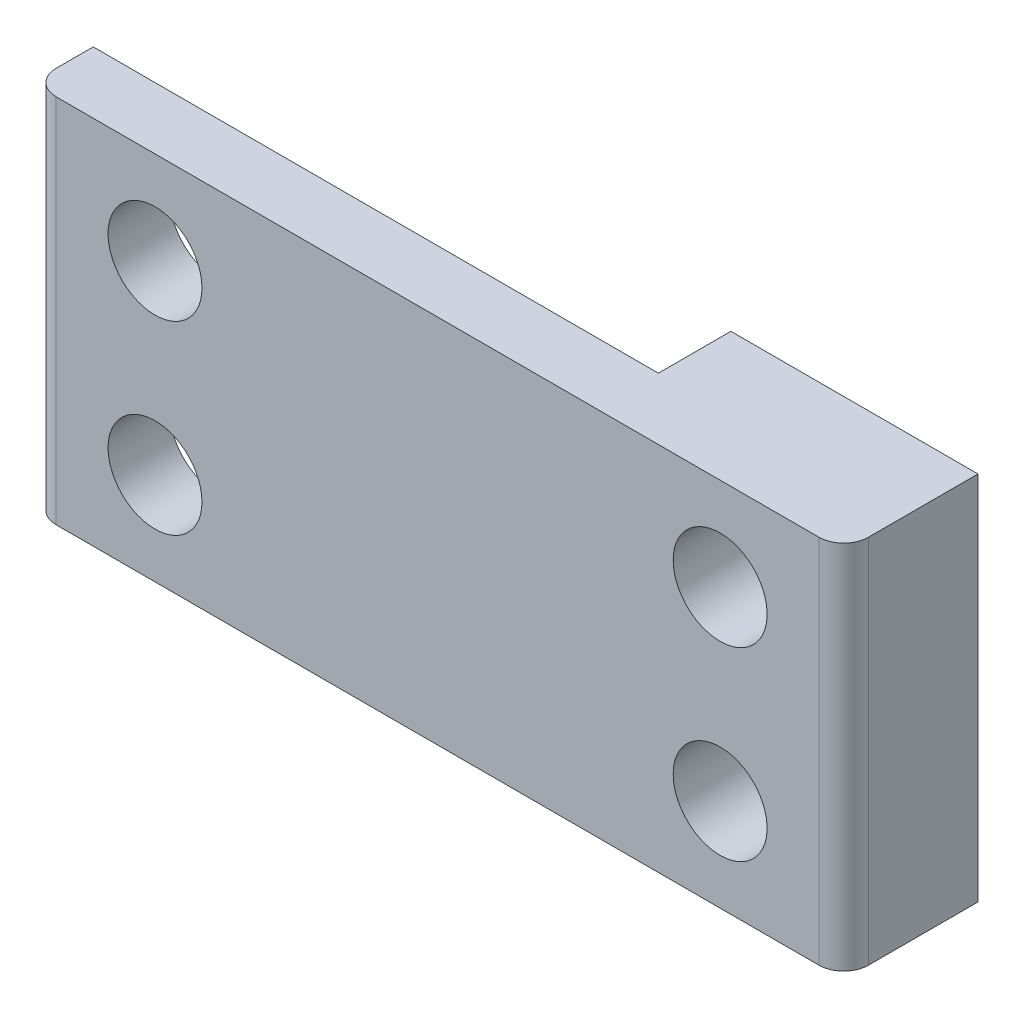
ISO-10303-21;
HEADER;
FILE_DESCRIPTION(('STEP AP214'),'2;1');
FILE_NAME('part.step','',(''),(''),'','','');
FILE_SCHEMA(('AUTOMOTIVE_DESIGN { 1 0 10303 214 1 1 1 1 }'));
ENDSEC;
DATA;
#1=APPLICATION_CONTEXT('core data for automotive mechanical design processes');
#2=APPLICATION_PROTOCOL_DEFINITION('international standard','automotive_design',2000,#1);
#3=PRODUCT_CONTEXT('',#1,'mechanical');
#4=PRODUCT('Part','Part','',(#3));
#5=PRODUCT_RELATED_PRODUCT_CATEGORY('part','',(#4));
#6=PRODUCT_DEFINITION_FORMATION('','',#4);
#7=PRODUCT_DEFINITION_CONTEXT('part definition',#1,'design');
#8=PRODUCT_DEFINITION('design','',#6,#7);
#9=PRODUCT_DEFINITION_SHAPE('','',#8);
#10=(LENGTH_UNIT() NAMED_UNIT(*) SI_UNIT(.MILLI.,.METRE.));
#11=(NAMED_UNIT(*) PLANE_ANGLE_UNIT() SI_UNIT($,.RADIAN.));
#12=(NAMED_UNIT(*) SI_UNIT($,.STERADIAN.) SOLID_ANGLE_UNIT());
#13=UNCERTAINTY_MEASURE_WITH_UNIT(LENGTH_MEASURE(1.E-05),#10,'distance_accuracy_value','');
#14=(GEOMETRIC_REPRESENTATION_CONTEXT(3) GLOBAL_UNCERTAINTY_ASSIGNED_CONTEXT((#13)) GLOBAL_UNIT_ASSIGNED_CONTEXT((#10,
#11,#12)) REPRESENTATION_CONTEXT('',''));
#15=CARTESIAN_POINT('',(0.,0.,0.));
#16=DIRECTION('',(0.,0.,1.));
#17=DIRECTION('',(1.,0.,0.));
#18=AXIS2_PLACEMENT_3D('',#15,#16,#17);
#19=CARTESIAN_POINT('',(41.7449,-19.05,6.35));
#20=DIRECTION('',(-1.,0.,0.));
#21=DIRECTION('',(0.,0.,1.));
#22=AXIS2_PLACEMENT_3D('',#19,#20,#21);
#23=PLANE('',#22);
#24=DIRECTION('',(0.,0.,-1.));
#25=VECTOR('',#24,1.);
#26=CARTESIAN_POINT('',(41.7449,19.05,6.35));
#27=LINE('',#26,#25);
#28=CARTESIAN_POINT('',(41.7449,19.05,3.81));
#29=VERTEX_POINT('',#28);
#30=CARTESIAN_POINT('',(41.7449,19.05,-7.4549));
#31=VERTEX_POINT('',#30);
#32=EDGE_CURVE('E161',#29,#31,#27,.T.);
#33=ORIENTED_EDGE('',*,*,#32,.F.);
#34=DIRECTION('',(0.,1.,0.));
#35=VECTOR('',#34,1.);
#36=CARTESIAN_POINT('',(41.7449,-19.05,3.81));
#37=LINE('',#36,#35);
#38=CARTESIAN_POINT('',(41.7449,-19.05,3.81));
#39=VERTEX_POINT('',#38);
#40=EDGE_CURVE('E11',#29,#39,#37,.F.);
#41=ORIENTED_EDGE('',*,*,#40,.T.);
#42=DIRECTION('',(0.,0.,-1.));
#43=VECTOR('',#42,1.);
#44=CARTESIAN_POINT('',(41.7449,-19.05,6.35));
#45=LINE('',#44,#43);
#46=CARTESIAN_POINT('',(41.7449,-19.05,-7.4549));
#47=VERTEX_POINT('',#46);
#48=EDGE_CURVE('E105',#39,#47,#45,.T.);
#49=ORIENTED_EDGE('',*,*,#48,.T.);
#50=DIRECTION('',(0.,-1.,0.));
#51=VECTOR('',#50,1.);
#52=CARTESIAN_POINT('',(41.7449,19.05,-7.4549));
#53=LINE('',#52,#51);
#54=EDGE_CURVE('E108',#31,#47,#53,.T.);
#55=ORIENTED_EDGE('',*,*,#54,.F.);
#56=EDGE_LOOP('',(#33,#41,#49,#55));
#57=FACE_BOUND('',#56,.T.);
#58=ADVANCED_FACE('F40',(#57),#23,.F.);
#59=CARTESIAN_POINT('',(-41.7449,19.05,6.35));
#60=DIRECTION('',(0.,-1.,0.));
#61=DIRECTION('',(0.,0.,-1.));
#62=AXIS2_PLACEMENT_3D('',#59,#60,#61);
#63=PLANE('',#62);
#64=DIRECTION('',(0.,0.,-1.));
#65=VECTOR('',#64,1.);
#66=CARTESIAN_POINT('',(-41.7449,19.05,6.35));
#67=LINE('',#66,#65);
#68=CARTESIAN_POINT('',(-41.7449,19.05,3.81));
#69=VERTEX_POINT('',#68);
#70=CARTESIAN_POINT('',(-41.7449,19.05,0.));
#71=VERTEX_POINT('',#70);
#72=EDGE_CURVE('E159',#69,#71,#67,.T.);
#73=ORIENTED_EDGE('',*,*,#72,.F.);
#74=CARTESIAN_POINT('',(-39.2049,19.05,3.81));
#75=DIRECTION('',(0.,-1.,0.));
#76=DIRECTION('',(0.,0.,-1.));
#77=AXIS2_PLACEMENT_3D('',#74,#75,#76);
#78=CIRCLE('',#77,2.54);
#79=CARTESIAN_POINT('',(-39.2049,19.05,6.35));
#80=VERTEX_POINT('',#79);
#81=EDGE_CURVE('E48',#69,#80,#78,.F.);
#82=ORIENTED_EDGE('',*,*,#81,.T.);
#83=DIRECTION('',(-1.,0.,0.));
#84=VECTOR('',#83,1.);
#85=CARTESIAN_POINT('',(-41.7449,19.05,6.35));
#86=LINE('',#85,#84);
#87=CARTESIAN_POINT('',(39.2049,19.05,6.35));
#88=VERTEX_POINT('',#87);
#89=EDGE_CURVE('E146',#88,#80,#86,.T.);
#90=ORIENTED_EDGE('',*,*,#89,.F.);
#91=CARTESIAN_POINT('',(39.2049,19.05,3.81));
#92=DIRECTION('',(0.,-1.,0.));
#93=DIRECTION('',(0.,0.,-1.));
#94=AXIS2_PLACEMENT_3D('',#91,#92,#93);
#95=CIRCLE('',#94,2.54);
#96=EDGE_CURVE('E55',#88,#29,#95,.F.);
#97=ORIENTED_EDGE('',*,*,#96,.T.);
#98=ORIENTED_EDGE('',*,*,#32,.T.);
#99=DIRECTION('',(1.,0.,0.));
#100=VECTOR('',#99,1.);
#101=CARTESIAN_POINT('',(41.7449,19.05,-7.4549));
#102=LINE('',#101,#100);
#103=CARTESIAN_POINT('',(16.3449,19.05,-7.4549));
#104=VERTEX_POINT('',#103);
#105=EDGE_CURVE('E129',#104,#31,#102,.T.);
#106=ORIENTED_EDGE('',*,*,#105,.F.);
#107=DIRECTION('',(0.,0.,1.));
#108=VECTOR('',#107,1.);
#109=CARTESIAN_POINT('',(16.3449,19.05,-7.4549));
#110=LINE('',#109,#108);
#111=CARTESIAN_POINT('',(16.3449,19.05,0.));
#112=VERTEX_POINT('',#111);
#113=EDGE_CURVE('E140',#104,#112,#110,.T.);
#114=ORIENTED_EDGE('',*,*,#113,.T.);
#115=DIRECTION('',(-1.,0.,0.));
#116=VECTOR('',#115,1.);
#117=CARTESIAN_POINT('',(-41.7449,19.05,0.));
#118=LINE('',#117,#116);
#119=EDGE_CURVE('E145',#112,#71,#118,.T.);
#120=ORIENTED_EDGE('',*,*,#119,.T.);
#121=EDGE_LOOP('',(#73,#82,#90,#97,#98,#106,#114,#120));
#122=FACE_BOUND('',#121,.T.);
#123=ADVANCED_FACE('F188',(#122),#63,.F.);
#124=CARTESIAN_POINT('',(-41.7449,-19.05,6.35));
#125=DIRECTION('',(1.,0.,0.));
#126=DIRECTION('',(0.,0.,-1.));
#127=AXIS2_PLACEMENT_3D('',#124,#125,#126);
#128=PLANE('',#127);
#129=DIRECTION('',(0.,0.,-1.));
#130=VECTOR('',#129,1.);
#131=CARTESIAN_POINT('',(-41.7449,-19.05,6.35));
#132=LINE('',#131,#130);
#133=CARTESIAN_POINT('',(-41.7449,-19.05,3.81));
#134=VERTEX_POINT('',#133);
#135=CARTESIAN_POINT('',(-41.7449,-19.05,0.));
#136=VERTEX_POINT('',#135);
#137=EDGE_CURVE('E112',#134,#136,#132,.T.);
#138=ORIENTED_EDGE('',*,*,#137,.F.);
#139=DIRECTION('',(0.,-1.,0.));
#140=VECTOR('',#139,1.);
#141=CARTESIAN_POINT('',(-41.7449,-19.05,3.81));
#142=LINE('',#141,#140);
#143=EDGE_CURVE('E63',#134,#69,#142,.F.);
#144=ORIENTED_EDGE('',*,*,#143,.T.);
#145=ORIENTED_EDGE('',*,*,#72,.T.);
#146=DIRECTION('',(0.,-1.,0.));
#147=VECTOR('',#146,1.);
#148=CARTESIAN_POINT('',(-41.7449,-19.05,0.));
#149=LINE('',#148,#147);
#150=EDGE_CURVE('E154',#71,#136,#149,.T.);
#151=ORIENTED_EDGE('',*,*,#150,.T.);
#152=EDGE_LOOP('',(#138,#144,#145,#151));
#153=FACE_BOUND('',#152,.T.);
#154=ADVANCED_FACE('F195',(#153),#128,.F.);
#155=CARTESIAN_POINT('',(-41.7449,-19.05,6.35));
#156=DIRECTION('',(0.,1.,0.));
#157=DIRECTION('',(0.,0.,1.));
#158=AXIS2_PLACEMENT_3D('',#155,#156,#157);
#159=PLANE('',#158);
#160=DIRECTION('',(1.,0.,0.));
#161=VECTOR('',#160,1.);
#162=CARTESIAN_POINT('',(-41.7449,-19.05,6.35));
#163=LINE('',#162,#161);
#164=CARTESIAN_POINT('',(-39.2049,-19.05,6.35));
#165=VERTEX_POINT('',#164);
#166=CARTESIAN_POINT('',(39.2049,-19.05,6.35));
#167=VERTEX_POINT('',#166);
#168=EDGE_CURVE('E113',#165,#167,#163,.T.);
#169=ORIENTED_EDGE('',*,*,#168,.F.);
#170=CARTESIAN_POINT('',(-39.2049,-19.05,3.81));
#171=DIRECTION('',(0.,1.,0.));
#172=DIRECTION('',(0.,0.,1.));
#173=AXIS2_PLACEMENT_3D('',#170,#171,#172);
#174=CIRCLE('',#173,2.54);
#175=EDGE_CURVE('E184',#165,#134,#174,.F.);
#176=ORIENTED_EDGE('',*,*,#175,.T.);
#177=ORIENTED_EDGE('',*,*,#137,.T.);
#178=DIRECTION('',(1.,0.,0.));
#179=VECTOR('',#178,1.);
#180=CARTESIAN_POINT('',(-41.7449,-19.05,0.));
#181=LINE('',#180,#179);
#182=CARTESIAN_POINT('',(16.3449,-19.05,0.));
#183=VERTEX_POINT('',#182);
#184=EDGE_CURVE('E149',#136,#183,#181,.T.);
#185=ORIENTED_EDGE('',*,*,#184,.T.);
#186=DIRECTION('',(0.,0.,1.));
#187=VECTOR('',#186,1.);
#188=CARTESIAN_POINT('',(16.3449,-19.05,-7.4549));
#189=LINE('',#188,#187);
#190=CARTESIAN_POINT('',(16.3449,-19.05,-7.4549));
#191=VERTEX_POINT('',#190);
#192=EDGE_CURVE('E121',#191,#183,#189,.T.);
#193=ORIENTED_EDGE('',*,*,#192,.F.);
#194=DIRECTION('',(-1.,0.,0.));
#195=VECTOR('',#194,1.);
#196=CARTESIAN_POINT('',(41.7449,-19.05,-7.4549));
#197=LINE('',#196,#195);
#198=EDGE_CURVE('E116',#47,#191,#197,.T.);
#199=ORIENTED_EDGE('',*,*,#198,.F.);
#200=ORIENTED_EDGE('',*,*,#48,.F.);
#201=CARTESIAN_POINT('',(39.2049,-19.05,3.81));
#202=DIRECTION('',(0.,1.,0.));
#203=DIRECTION('',(0.,0.,1.));
#204=AXIS2_PLACEMENT_3D('',#201,#202,#203);
#205=CIRCLE('',#204,2.54);
#206=EDGE_CURVE('E182',#39,#167,#205,.F.);
#207=ORIENTED_EDGE('',*,*,#206,.T.);
#208=EDGE_LOOP('',(#169,#176,#177,#185,#193,#199,#200,#207));
#209=FACE_BOUND('',#208,.T.);
#210=ADVANCED_FACE('F118',(#209),#159,.F.);
#211=CARTESIAN_POINT('',(0.,0.,6.35));
#212=DIRECTION('',(0.,0.,-1.));
#213=DIRECTION('',(-1.,0.,0.));
#214=AXIS2_PLACEMENT_3D('',#211,#212,#213);
#215=PLANE('',#214);
#216=CARTESIAN_POINT('',(-29.0449,-9.525,6.35));
#217=DIRECTION('',(0.,0.,1.));
#218=DIRECTION('',(1.,0.,0.));
#219=AXIS2_PLACEMENT_3D('',#216,#217,#218);
#220=CIRCLE('',#219,4.826);
#221=CARTESIAN_POINT('',(-24.2189,-9.525,6.35));
#222=VERTEX_POINT('',#221);
#223=EDGE_CURVE('E174',#222,#222,#220,.T.);
#224=ORIENTED_EDGE('',*,*,#223,.F.);
#225=EDGE_LOOP('',(#224));
#226=FACE_BOUND('',#225,.T.);
#227=CARTESIAN_POINT('',(-29.0449,9.52500000000001,6.35));
#228=DIRECTION('',(0.,0.,1.));
#229=DIRECTION('',(-1.,0.,0.));
#230=AXIS2_PLACEMENT_3D('',#227,#228,#229);
#231=CIRCLE('',#230,4.826);
#232=CARTESIAN_POINT('',(-24.2189,9.52500000000001,6.35));
#233=VERTEX_POINT('',#232);
#234=EDGE_CURVE('E251',#233,#233,#231,.T.);
#235=ORIENTED_EDGE('',*,*,#234,.F.);
#236=EDGE_LOOP('',(#235));
#237=FACE_BOUND('',#236,.T.);
#238=CARTESIAN_POINT('',(29.0449,9.525,6.35));
#239=DIRECTION('',(0.,0.,-1.));
#240=DIRECTION('',(-1.,0.,0.));
#241=AXIS2_PLACEMENT_3D('',#238,#239,#240);
#242=CIRCLE('',#241,4.826);
#243=CARTESIAN_POINT('',(24.2189,9.525,6.35));
#244=VERTEX_POINT('',#243);
#245=EDGE_CURVE('E167',#244,#244,#242,.T.);
#246=ORIENTED_EDGE('',*,*,#245,.T.);
#247=EDGE_LOOP('',(#246));
#248=FACE_BOUND('',#247,.T.);
#249=CARTESIAN_POINT('',(29.0449,-9.525,6.35));
#250=DIRECTION('',(0.,0.,-1.));
#251=DIRECTION('',(1.,0.,0.));
#252=AXIS2_PLACEMENT_3D('',#249,#250,#251);
#253=CIRCLE('',#252,4.826);
#254=CARTESIAN_POINT('',(24.2189,-9.525,6.35));
#255=VERTEX_POINT('',#254);
#256=EDGE_CURVE('E136',#255,#255,#253,.T.);
#257=ORIENTED_EDGE('',*,*,#256,.T.);
#258=EDGE_LOOP('',(#257));
#259=FACE_BOUND('',#258,.T.);
#260=ORIENTED_EDGE('',*,*,#89,.T.);
#261=DIRECTION('',(0.,-1.,0.));
#262=VECTOR('',#261,1.);
#263=CARTESIAN_POINT('',(-39.2049,0.,6.35));
#264=LINE('',#263,#262);
#265=EDGE_CURVE('E179',#80,#165,#264,.T.);
#266=ORIENTED_EDGE('',*,*,#265,.T.);
#267=ORIENTED_EDGE('',*,*,#168,.T.);
#268=DIRECTION('',(0.,1.,0.));
#269=VECTOR('',#268,1.);
#270=CARTESIAN_POINT('',(39.2049,0.,6.35));
#271=LINE('',#270,#269);
#272=EDGE_CURVE('E163',#167,#88,#271,.T.);
#273=ORIENTED_EDGE('',*,*,#272,.T.);
#274=EDGE_LOOP('',(#260,#266,#267,#273));
#275=FACE_BOUND('',#274,.T.);
#276=ADVANCED_FACE('F192',(#226,#237,#248,#259,#275),#215,.F.);
#277=CARTESIAN_POINT('',(0.,0.,0.));
#278=DIRECTION('',(0.,0.,-1.));
#279=DIRECTION('',(-1.,0.,0.));
#280=AXIS2_PLACEMENT_3D('',#277,#278,#279);
#281=PLANE('',#280);
#282=CARTESIAN_POINT('',(-29.0449,-9.525,0.));
#283=DIRECTION('',(0.,0.,-1.));
#284=DIRECTION('',(-1.,0.,0.));
#285=AXIS2_PLACEMENT_3D('',#282,#283,#284);
#286=CIRCLE('',#285,4.826);
#287=CARTESIAN_POINT('',(-24.2189,-9.525,0.));
#288=VERTEX_POINT('',#287);
#289=EDGE_CURVE('E173',#288,#288,#286,.T.);
#290=ORIENTED_EDGE('',*,*,#289,.F.);
#291=EDGE_LOOP('',(#290));
#292=FACE_BOUND('',#291,.T.);
#293=CARTESIAN_POINT('',(-29.0449,9.52500000000001,0.));
#294=DIRECTION('',(0.,0.,-1.));
#295=DIRECTION('',(-1.,0.,0.));
#296=AXIS2_PLACEMENT_3D('',#293,#294,#295);
#297=CIRCLE('',#296,4.826);
#298=CARTESIAN_POINT('',(-24.2189,9.52500000000001,0.));
#299=VERTEX_POINT('',#298);
#300=EDGE_CURVE('E170',#299,#299,#297,.T.);
#301=ORIENTED_EDGE('',*,*,#300,.F.);
#302=EDGE_LOOP('',(#301));
#303=FACE_BOUND('',#302,.T.);
#304=DIRECTION('',(0.,1.,0.));
#305=VECTOR('',#304,1.);
#306=CARTESIAN_POINT('',(16.3449,19.05,0.));
#307=LINE('',#306,#305);
#308=EDGE_CURVE('E130',#183,#112,#307,.T.);
#309=ORIENTED_EDGE('',*,*,#308,.F.);
#310=ORIENTED_EDGE('',*,*,#184,.F.);
#311=ORIENTED_EDGE('',*,*,#150,.F.);
#312=ORIENTED_EDGE('',*,*,#119,.F.);
#313=EDGE_LOOP('',(#309,#310,#311,#312));
#314=FACE_BOUND('',#313,.T.);
#315=ADVANCED_FACE('F199',(#292,#303,#314),#281,.T.);
#316=CARTESIAN_POINT('',(16.3449,19.05,-7.4549));
#317=DIRECTION('',(1.,0.,0.));
#318=DIRECTION('',(0.,1.,0.));
#319=AXIS2_PLACEMENT_3D('',#316,#317,#318);
#320=PLANE('',#319);
#321=ORIENTED_EDGE('',*,*,#308,.T.);
#322=ORIENTED_EDGE('',*,*,#113,.F.);
#323=DIRECTION('',(0.,1.,0.));
#324=VECTOR('',#323,1.);
#325=CARTESIAN_POINT('',(16.3449,19.05,-7.4549));
#326=LINE('',#325,#324);
#327=EDGE_CURVE('E124',#191,#104,#326,.T.);
#328=ORIENTED_EDGE('',*,*,#327,.F.);
#329=ORIENTED_EDGE('',*,*,#192,.T.);
#330=EDGE_LOOP('',(#321,#322,#328,#329));
#331=FACE_BOUND('',#330,.T.);
#332=ADVANCED_FACE('F201',(#331),#320,.F.);
#333=CARTESIAN_POINT('',(0.,0.,-7.4549));
#334=DIRECTION('',(0.,0.,-1.));
#335=DIRECTION('',(-1.,0.,0.));
#336=AXIS2_PLACEMENT_3D('',#333,#334,#335);
#337=PLANE('',#336);
#338=CARTESIAN_POINT('',(29.0449,9.525,-7.4549));
#339=DIRECTION('',(0.,0.,-1.));
#340=DIRECTION('',(-1.,0.,0.));
#341=AXIS2_PLACEMENT_3D('',#338,#339,#340);
#342=CIRCLE('',#341,4.826);
#343=CARTESIAN_POINT('',(24.2189,9.525,-7.4549));
#344=VERTEX_POINT('',#343);
#345=EDGE_CURVE('E133',#344,#344,#342,.T.);
#346=ORIENTED_EDGE('',*,*,#345,.F.);
#347=EDGE_LOOP('',(#346));
#348=FACE_BOUND('',#347,.T.);
#349=CARTESIAN_POINT('',(29.0449,-9.525,-7.4549));
#350=DIRECTION('',(0.,0.,-1.));
#351=DIRECTION('',(-1.,0.,0.));
#352=AXIS2_PLACEMENT_3D('',#349,#350,#351);
#353=CIRCLE('',#352,4.826);
#354=CARTESIAN_POINT('',(24.2189,-9.525,-7.4549));
#355=VERTEX_POINT('',#354);
#356=EDGE_CURVE('E164',#355,#355,#353,.T.);
#357=ORIENTED_EDGE('',*,*,#356,.F.);
#358=EDGE_LOOP('',(#357));
#359=FACE_BOUND('',#358,.T.);
#360=ORIENTED_EDGE('',*,*,#54,.T.);
#361=ORIENTED_EDGE('',*,*,#198,.T.);
#362=ORIENTED_EDGE('',*,*,#327,.T.);
#363=ORIENTED_EDGE('',*,*,#105,.T.);
#364=EDGE_LOOP('',(#360,#361,#362,#363));
#365=FACE_BOUND('',#364,.T.);
#366=ADVANCED_FACE('F127',(#348,#359,#365),#337,.T.);
#367=CARTESIAN_POINT('',(29.0449,-9.525,6.35));
#368=DIRECTION('',(0.,0.,-1.));
#369=DIRECTION('',(-1.,0.,0.));
#370=AXIS2_PLACEMENT_3D('',#367,#368,#369);
#371=CYLINDRICAL_SURFACE('',#370,4.826);
#372=CARTESIAN_POINT('',(24.2189,-9.525,-7.4549));
#373=CARTESIAN_POINT('',(24.2189,-9.525,-7.31109895833333));
#374=CARTESIAN_POINT('',(24.2189,-9.525,-7.16729791666666));
#375=CARTESIAN_POINT('',(24.2189,-9.525,-6.87969583333333));
#376=CARTESIAN_POINT('',(24.2189,-9.525,-6.73589479166666));
#377=CARTESIAN_POINT('',(24.2189,-9.525,-6.44829270833333));
#378=CARTESIAN_POINT('',(24.2189,-9.525,-6.30449166666666));
#379=CARTESIAN_POINT('',(24.2189,-9.525,-6.01688958333333));
#380=CARTESIAN_POINT('',(24.2189,-9.525,-5.87308854166666));
#381=CARTESIAN_POINT('',(24.2189,-9.525,-5.58548645833333));
#382=CARTESIAN_POINT('',(24.2189,-9.525,-5.44168541666666));
#383=CARTESIAN_POINT('',(24.2189,-9.525,-5.15408333333333));
#384=CARTESIAN_POINT('',(24.2189,-9.525,-5.01028229166666));
#385=CARTESIAN_POINT('',(24.2189,-9.525,-4.72268020833333));
#386=CARTESIAN_POINT('',(24.2189,-9.525,-4.57887916666666));
#387=CARTESIAN_POINT('',(24.2189,-9.525,-4.29127708333333));
#388=CARTESIAN_POINT('',(24.2189,-9.525,-4.14747604166667));
#389=CARTESIAN_POINT('',(24.2189,-9.525,-3.85987395833333));
#390=CARTESIAN_POINT('',(24.2189,-9.525,-3.71607291666667));
#391=CARTESIAN_POINT('',(24.2189,-9.525,-3.42847083333333));
#392=CARTESIAN_POINT('',(24.2189,-9.525,-3.28466979166667));
#393=CARTESIAN_POINT('',(24.2189,-9.525,-2.99706770833333));
#394=CARTESIAN_POINT('',(24.2189,-9.525,-2.85326666666667));
#395=CARTESIAN_POINT('',(24.2189,-9.525,-2.56566458333333));
#396=CARTESIAN_POINT('',(24.2189,-9.525,-2.42186354166666));
#397=CARTESIAN_POINT('',(24.2189,-9.525,-2.13426145833333));
#398=CARTESIAN_POINT('',(24.2189,-9.525,-1.99046041666666));
#399=CARTESIAN_POINT('',(24.2189,-9.525,-1.70285833333333));
#400=CARTESIAN_POINT('',(24.2189,-9.525,-1.55905729166667));
#401=CARTESIAN_POINT('',(24.2189,-9.525,-1.27145520833333));
#402=CARTESIAN_POINT('',(24.2189,-9.525,-1.12765416666667));
#403=CARTESIAN_POINT('',(24.2189,-9.525,-0.840052083333333));
#404=CARTESIAN_POINT('',(24.2189,-9.525,-0.696251041666666));
#405=CARTESIAN_POINT('',(24.2189,-9.525,-0.408648958333333));
#406=CARTESIAN_POINT('',(24.2189,-9.525,-0.264847916666666));
#407=CARTESIAN_POINT('',(24.2189,-9.525,0.0227541666666672));
#408=CARTESIAN_POINT('',(24.2189,-9.525,0.166555208333334));
#409=CARTESIAN_POINT('',(24.2189,-9.525,0.454157291666667));
#410=CARTESIAN_POINT('',(24.2189,-9.525,0.597958333333333));
#411=CARTESIAN_POINT('',(24.2189,-9.525,0.885560416666666));
#412=CARTESIAN_POINT('',(24.2189,-9.525,1.02936145833333));
#413=CARTESIAN_POINT('',(24.2189,-9.525,1.31696354166667));
#414=CARTESIAN_POINT('',(24.2189,-9.525,1.46076458333333));
#415=CARTESIAN_POINT('',(24.2189,-9.525,1.74836666666667));
#416=CARTESIAN_POINT('',(24.2189,-9.525,1.89216770833333));
#417=CARTESIAN_POINT('',(24.2189,-9.525,2.17976979166667));
#418=CARTESIAN_POINT('',(24.2189,-9.525,2.32357083333333));
#419=CARTESIAN_POINT('',(24.2189,-9.525,2.61117291666667));
#420=CARTESIAN_POINT('',(24.2189,-9.525,2.75497395833333));
#421=CARTESIAN_POINT('',(24.2189,-9.525,3.04257604166667));
#422=CARTESIAN_POINT('',(24.2189,-9.525,3.18637708333333));
#423=CARTESIAN_POINT('',(24.2189,-9.525,3.47397916666667));
#424=CARTESIAN_POINT('',(24.2189,-9.525,3.61778020833333));
#425=CARTESIAN_POINT('',(24.2189,-9.525,3.90538229166667));
#426=CARTESIAN_POINT('',(24.2189,-9.525,4.04918333333333));
#427=CARTESIAN_POINT('',(24.2189,-9.525,4.33678541666667));
#428=CARTESIAN_POINT('',(24.2189,-9.525,4.48058645833333));
#429=CARTESIAN_POINT('',(24.2189,-9.525,4.76818854166667));
#430=CARTESIAN_POINT('',(24.2189,-9.525,4.91198958333333));
#431=CARTESIAN_POINT('',(24.2189,-9.525,5.19959166666667));
#432=CARTESIAN_POINT('',(24.2189,-9.525,5.34339270833333));
#433=CARTESIAN_POINT('',(24.2189,-9.525,5.63099479166666));
#434=CARTESIAN_POINT('',(24.2189,-9.525,5.77479583333333));
#435=CARTESIAN_POINT('',(24.2189,-9.525,6.06239791666667));
#436=CARTESIAN_POINT('',(24.2189,-9.525,6.20619895833333));
#437=CARTESIAN_POINT('',(24.2189,-9.525,6.35));
#438=B_SPLINE_CURVE_WITH_KNOTS('',3,(#372,#373,#374,#375,#376,#377,#378,#379,#380,#381,#382,
#383,#384,#385,#386,#387,#388,#389,#390,#391,#392,#393,#394,#395,#396,#397,#398,#399,#400,#401,
#402,#403,#404,#405,#406,#407,#408,#409,#410,#411,#412,#413,#414,#415,#416,#417,#418,#419,#420,
#421,#422,#423,#424,#425,#426,#427,#428,#429,#430,#431,#432,#433,#434,#435,#436,#437),
.UNSPECIFIED.,.F.,.F.,(4,2,2,2,2,2,2,2,2,2,2,2,2,2,2,2,2,2,2,2,2,2,2,2,2,2,2,2,2,2,2,2,4),(0.,
0.431403125,0.862806250000001,1.294209375,1.7256125,2.157015625,2.58841875,3.019821875,3.451225,
3.882628125,4.31403125,4.745434375,5.1768375,5.608240625,6.03964375,6.471046875,6.90245,
7.333853125,7.76525625,8.196659375,8.6280625,9.059465625,9.49086875,9.922271875,10.353675,
10.785078125,11.21648125,11.647884375,12.0792875,12.510690625,12.94209375,13.373496875,13.8049),.UNSPECIFIED.);
#439=EDGE_CURVE('BSEAM231',#355,#255,#438,.T.);
#440=ORIENTED_EDGE('',*,*,#356,.T.);
#441=ORIENTED_EDGE('',*,*,#256,.F.);
#442=ORIENTED_EDGE('',*,*,#439,.T.);
#443=ORIENTED_EDGE('',*,*,#439,.F.);
#444=EDGE_LOOP('',(#440,#442,#441,#443));
#445=FACE_BOUND('',#444,.T.);
#446=ADVANCED_FACE('F231',(#445),#371,.F.);
#447=CARTESIAN_POINT('',(29.0449,9.525,6.35));
#448=DIRECTION('',(0.,0.,-1.));
#449=DIRECTION('',(-1.,0.,0.));
#450=AXIS2_PLACEMENT_3D('',#447,#448,#449);
#451=CYLINDRICAL_SURFACE('',#450,4.826);
#452=CARTESIAN_POINT('',(24.2189,9.525,-7.4549));
#453=CARTESIAN_POINT('',(24.2189,9.525,-7.31109895833333));
#454=CARTESIAN_POINT('',(24.2189,9.525,-7.16729791666666));
#455=CARTESIAN_POINT('',(24.2189,9.525,-6.87969583333333));
#456=CARTESIAN_POINT('',(24.2189,9.525,-6.73589479166666));
#457=CARTESIAN_POINT('',(24.2189,9.525,-6.44829270833333));
#458=CARTESIAN_POINT('',(24.2189,9.525,-6.30449166666666));
#459=CARTESIAN_POINT('',(24.2189,9.525,-6.01688958333333));
#460=CARTESIAN_POINT('',(24.2189,9.525,-5.87308854166666));
#461=CARTESIAN_POINT('',(24.2189,9.525,-5.58548645833333));
#462=CARTESIAN_POINT('',(24.2189,9.525,-5.44168541666666));
#463=CARTESIAN_POINT('',(24.2189,9.525,-5.15408333333333));
#464=CARTESIAN_POINT('',(24.2189,9.525,-5.01028229166666));
#465=CARTESIAN_POINT('',(24.2189,9.525,-4.72268020833333));
#466=CARTESIAN_POINT('',(24.2189,9.525,-4.57887916666666));
#467=CARTESIAN_POINT('',(24.2189,9.525,-4.29127708333333));
#468=CARTESIAN_POINT('',(24.2189,9.525,-4.14747604166667));
#469=CARTESIAN_POINT('',(24.2189,9.525,-3.85987395833333));
#470=CARTESIAN_POINT('',(24.2189,9.525,-3.71607291666667));
#471=CARTESIAN_POINT('',(24.2189,9.525,-3.42847083333333));
#472=CARTESIAN_POINT('',(24.2189,9.525,-3.28466979166667));
#473=CARTESIAN_POINT('',(24.2189,9.525,-2.99706770833333));
#474=CARTESIAN_POINT('',(24.2189,9.525,-2.85326666666667));
#475=CARTESIAN_POINT('',(24.2189,9.525,-2.56566458333333));
#476=CARTESIAN_POINT('',(24.2189,9.525,-2.42186354166666));
#477=CARTESIAN_POINT('',(24.2189,9.525,-2.13426145833333));
#478=CARTESIAN_POINT('',(24.2189,9.525,-1.99046041666666));
#479=CARTESIAN_POINT('',(24.2189,9.525,-1.70285833333333));
#480=CARTESIAN_POINT('',(24.2189,9.525,-1.55905729166667));
#481=CARTESIAN_POINT('',(24.2189,9.525,-1.27145520833333));
#482=CARTESIAN_POINT('',(24.2189,9.525,-1.12765416666667));
#483=CARTESIAN_POINT('',(24.2189,9.525,-0.840052083333333));
#484=CARTESIAN_POINT('',(24.2189,9.525,-0.696251041666666));
#485=CARTESIAN_POINT('',(24.2189,9.525,-0.408648958333333));
#486=CARTESIAN_POINT('',(24.2189,9.525,-0.264847916666666));
#487=CARTESIAN_POINT('',(24.2189,9.525,0.0227541666666672));
#488=CARTESIAN_POINT('',(24.2189,9.525,0.166555208333334));
#489=CARTESIAN_POINT('',(24.2189,9.525,0.454157291666667));
#490=CARTESIAN_POINT('',(24.2189,9.525,0.597958333333333));
#491=CARTESIAN_POINT('',(24.2189,9.525,0.885560416666666));
#492=CARTESIAN_POINT('',(24.2189,9.525,1.02936145833333));
#493=CARTESIAN_POINT('',(24.2189,9.525,1.31696354166667));
#494=CARTESIAN_POINT('',(24.2189,9.525,1.46076458333333));
#495=CARTESIAN_POINT('',(24.2189,9.525,1.74836666666667));
#496=CARTESIAN_POINT('',(24.2189,9.525,1.89216770833333));
#497=CARTESIAN_POINT('',(24.2189,9.525,2.17976979166667));
#498=CARTESIAN_POINT('',(24.2189,9.525,2.32357083333333));
#499=CARTESIAN_POINT('',(24.2189,9.525,2.61117291666667));
#500=CARTESIAN_POINT('',(24.2189,9.525,2.75497395833333));
#501=CARTESIAN_POINT('',(24.2189,9.525,3.04257604166667));
#502=CARTESIAN_POINT('',(24.2189,9.525,3.18637708333333));
#503=CARTESIAN_POINT('',(24.2189,9.525,3.47397916666667));
#504=CARTESIAN_POINT('',(24.2189,9.525,3.61778020833333));
#505=CARTESIAN_POINT('',(24.2189,9.525,3.90538229166667));
#506=CARTESIAN_POINT('',(24.2189,9.525,4.04918333333333));
#507=CARTESIAN_POINT('',(24.2189,9.525,4.33678541666667));
#508=CARTESIAN_POINT('',(24.2189,9.525,4.48058645833333));
#509=CARTESIAN_POINT('',(24.2189,9.525,4.76818854166667));
#510=CARTESIAN_POINT('',(24.2189,9.525,4.91198958333333));
#511=CARTESIAN_POINT('',(24.2189,9.525,5.19959166666667));
#512=CARTESIAN_POINT('',(24.2189,9.525,5.34339270833333));
#513=CARTESIAN_POINT('',(24.2189,9.525,5.63099479166666));
#514=CARTESIAN_POINT('',(24.2189,9.525,5.77479583333333));
#515=CARTESIAN_POINT('',(24.2189,9.525,6.06239791666667));
#516=CARTESIAN_POINT('',(24.2189,9.525,6.20619895833333));
#517=CARTESIAN_POINT('',(24.2189,9.525,6.35));
#518=B_SPLINE_CURVE_WITH_KNOTS('',3,(#452,#453,#454,#455,#456,#457,#458,#459,#460,#461,#462,
#463,#464,#465,#466,#467,#468,#469,#470,#471,#472,#473,#474,#475,#476,#477,#478,#479,#480,#481,
#482,#483,#484,#485,#486,#487,#488,#489,#490,#491,#492,#493,#494,#495,#496,#497,#498,#499,#500,
#501,#502,#503,#504,#505,#506,#507,#508,#509,#510,#511,#512,#513,#514,#515,#516,#517),
.UNSPECIFIED.,.F.,.F.,(4,2,2,2,2,2,2,2,2,2,2,2,2,2,2,2,2,2,2,2,2,2,2,2,2,2,2,2,2,2,2,2,4),(0.,
0.431403125,0.862806250000001,1.294209375,1.7256125,2.157015625,2.58841875,3.019821875,3.451225,
3.882628125,4.31403125,4.745434375,5.1768375,5.608240625,6.03964375,6.471046875,6.90245,
7.333853125,7.76525625,8.196659375,8.6280625,9.059465625,9.49086875,9.922271875,10.353675,
10.785078125,11.21648125,11.647884375,12.0792875,12.510690625,12.94209375,13.373496875,13.8049),.UNSPECIFIED.);
#519=EDGE_CURVE('BSEAM235',#344,#244,#518,.T.);
#520=ORIENTED_EDGE('',*,*,#345,.T.);
#521=ORIENTED_EDGE('',*,*,#245,.F.);
#522=ORIENTED_EDGE('',*,*,#519,.T.);
#523=ORIENTED_EDGE('',*,*,#519,.F.);
#524=EDGE_LOOP('',(#520,#522,#521,#523));
#525=FACE_BOUND('',#524,.T.);
#526=ADVANCED_FACE('F235',(#525),#451,.F.);
#527=CARTESIAN_POINT('',(-29.0449,9.52500000000001,-7.4549));
#528=DIRECTION('',(0.,0.,1.));
#529=DIRECTION('',(1.,0.,0.));
#530=AXIS2_PLACEMENT_3D('',#527,#528,#529);
#531=CYLINDRICAL_SURFACE('',#530,4.826);
#532=CARTESIAN_POINT('',(-24.2189,9.52500000000001,0.));
#533=CARTESIAN_POINT('',(-24.2189,9.52500000000001,0.0661458333333341));
#534=CARTESIAN_POINT('',(-24.2189,9.52500000000001,0.132291666666667));
#535=CARTESIAN_POINT('',(-24.2189,9.52500000000001,0.264583333333334));
#536=CARTESIAN_POINT('',(-24.2189,9.52500000000001,0.330729166666667));
#537=CARTESIAN_POINT('',(-24.2189,9.52500000000001,0.463020833333333));
#538=CARTESIAN_POINT('',(-24.2189,9.52500000000001,0.529166666666667));
#539=CARTESIAN_POINT('',(-24.2189,9.52500000000001,0.661458333333333));
#540=CARTESIAN_POINT('',(-24.2189,9.52500000000001,0.727604166666666));
#541=CARTESIAN_POINT('',(-24.2189,9.52500000000001,0.859895833333333));
#542=CARTESIAN_POINT('',(-24.2189,9.52500000000001,0.926041666666666));
#543=CARTESIAN_POINT('',(-24.2189,9.52500000000001,1.05833333333333));
#544=CARTESIAN_POINT('',(-24.2189,9.52500000000001,1.12447916666667));
#545=CARTESIAN_POINT('',(-24.2189,9.52500000000001,1.25677083333333));
#546=CARTESIAN_POINT('',(-24.2189,9.52500000000001,1.32291666666667));
#547=CARTESIAN_POINT('',(-24.2189,9.52500000000001,1.45520833333333));
#548=CARTESIAN_POINT('',(-24.2189,9.52500000000001,1.52135416666667));
#549=CARTESIAN_POINT('',(-24.2189,9.52500000000001,1.65364583333333));
#550=CARTESIAN_POINT('',(-24.2189,9.52500000000001,1.71979166666667));
#551=CARTESIAN_POINT('',(-24.2189,9.52500000000001,1.85208333333333));
#552=CARTESIAN_POINT('',(-24.2189,9.52500000000001,1.91822916666667));
#553=CARTESIAN_POINT('',(-24.2189,9.52500000000001,2.05052083333333));
#554=CARTESIAN_POINT('',(-24.2189,9.52500000000001,2.11666666666667));
#555=CARTESIAN_POINT('',(-24.2189,9.52500000000001,2.24895833333333));
#556=CARTESIAN_POINT('',(-24.2189,9.52500000000001,2.31510416666667));
#557=CARTESIAN_POINT('',(-24.2189,9.52500000000001,2.44739583333333));
#558=CARTESIAN_POINT('',(-24.2189,9.52500000000001,2.51354166666667));
#559=CARTESIAN_POINT('',(-24.2189,9.52500000000001,2.64583333333333));
#560=CARTESIAN_POINT('',(-24.2189,9.52500000000001,2.71197916666667));
#561=CARTESIAN_POINT('',(-24.2189,9.52500000000001,2.84427083333333));
#562=CARTESIAN_POINT('',(-24.2189,9.52500000000001,2.91041666666667));
#563=CARTESIAN_POINT('',(-24.2189,9.52500000000001,3.04270833333333));
#564=CARTESIAN_POINT('',(-24.2189,9.52500000000001,3.10885416666667));
#565=CARTESIAN_POINT('',(-24.2189,9.52500000000001,3.24114583333333));
#566=CARTESIAN_POINT('',(-24.2189,9.52500000000001,3.30729166666667));
#567=CARTESIAN_POINT('',(-24.2189,9.52500000000001,3.43958333333333));
#568=CARTESIAN_POINT('',(-24.2189,9.52500000000001,3.50572916666667));
#569=CARTESIAN_POINT('',(-24.2189,9.52500000000001,3.63802083333333));
#570=CARTESIAN_POINT('',(-24.2189,9.52500000000001,3.70416666666667));
#571=CARTESIAN_POINT('',(-24.2189,9.52500000000001,3.83645833333333));
#572=CARTESIAN_POINT('',(-24.2189,9.52500000000001,3.90260416666667));
#573=CARTESIAN_POINT('',(-24.2189,9.52500000000001,4.03489583333333));
#574=CARTESIAN_POINT('',(-24.2189,9.52500000000001,4.10104166666667));
#575=CARTESIAN_POINT('',(-24.2189,9.52500000000001,4.23333333333333));
#576=CARTESIAN_POINT('',(-24.2189,9.52500000000001,4.29947916666667));
#577=CARTESIAN_POINT('',(-24.2189,9.52500000000001,4.43177083333333));
#578=CARTESIAN_POINT('',(-24.2189,9.52500000000001,4.49791666666667));
#579=CARTESIAN_POINT('',(-24.2189,9.52500000000001,4.63020833333333));
#580=CARTESIAN_POINT('',(-24.2189,9.52500000000001,4.69635416666667));
#581=CARTESIAN_POINT('',(-24.2189,9.52500000000001,4.82864583333333));
#582=CARTESIAN_POINT('',(-24.2189,9.52500000000001,4.89479166666667));
#583=CARTESIAN_POINT('',(-24.2189,9.52500000000001,5.02708333333333));
#584=CARTESIAN_POINT('',(-24.2189,9.52500000000001,5.09322916666666));
#585=CARTESIAN_POINT('',(-24.2189,9.52500000000001,5.22552083333333));
#586=CARTESIAN_POINT('',(-24.2189,9.52500000000001,5.29166666666666));
#587=CARTESIAN_POINT('',(-24.2189,9.52500000000001,5.42395833333333));
#588=CARTESIAN_POINT('',(-24.2189,9.52500000000001,5.49010416666667));
#589=CARTESIAN_POINT('',(-24.2189,9.52500000000001,5.62239583333333));
#590=CARTESIAN_POINT('',(-24.2189,9.52500000000001,5.68854166666666));
#591=CARTESIAN_POINT('',(-24.2189,9.52500000000001,5.82083333333333));
#592=CARTESIAN_POINT('',(-24.2189,9.52500000000001,5.88697916666666));
#593=CARTESIAN_POINT('',(-24.2189,9.52500000000001,6.01927083333333));
#594=CARTESIAN_POINT('',(-24.2189,9.52500000000001,6.08541666666667));
#595=CARTESIAN_POINT('',(-24.2189,9.52500000000001,6.21770833333333));
#596=CARTESIAN_POINT('',(-24.2189,9.52500000000001,6.28385416666667));
#597=CARTESIAN_POINT('',(-24.2189,9.52500000000001,6.35));
#598=B_SPLINE_CURVE_WITH_KNOTS('',3,(#532,#533,#534,#535,#536,#537,#538,#539,#540,#541,#542,
#543,#544,#545,#546,#547,#548,#549,#550,#551,#552,#553,#554,#555,#556,#557,#558,#559,#560,#561,
#562,#563,#564,#565,#566,#567,#568,#569,#570,#571,#572,#573,#574,#575,#576,#577,#578,#579,#580,
#581,#582,#583,#584,#585,#586,#587,#588,#589,#590,#591,#592,#593,#594,#595,#596,#597),
.UNSPECIFIED.,.F.,.F.,(4,2,2,2,2,2,2,2,2,2,2,2,2,2,2,2,2,2,2,2,2,2,2,2,2,2,2,2,2,2,2,2,4),(0.,
0.1984375,0.396874999999999,0.595312499999999,0.793749999999998,0.992187499999999,1.190625,
1.3890625,1.5875,1.7859375,1.984375,2.1828125,2.38125,2.5796875,2.778125,2.9765625,3.175,
3.3734375,3.571875,3.7703125,3.96875,4.1671875,4.365625,4.5640625,4.7625,4.9609375,5.159375,
5.3578125,5.55625,5.7546875,5.953125,6.1515625,6.35),.UNSPECIFIED.);
#599=EDGE_CURVE('BSEAM239',#299,#233,#598,.T.);
#600=ORIENTED_EDGE('',*,*,#300,.T.);
#601=ORIENTED_EDGE('',*,*,#234,.T.);
#602=ORIENTED_EDGE('',*,*,#599,.T.);
#603=ORIENTED_EDGE('',*,*,#599,.F.);
#604=EDGE_LOOP('',(#600,#602,#601,#603));
#605=FACE_BOUND('',#604,.T.);
#606=ADVANCED_FACE('F239',(#605),#531,.F.);
#607=CARTESIAN_POINT('',(-29.0449,-9.525,-7.4549));
#608=DIRECTION('',(0.,0.,1.));
#609=DIRECTION('',(1.,0.,0.));
#610=AXIS2_PLACEMENT_3D('',#607,#608,#609);
#611=CYLINDRICAL_SURFACE('',#610,4.826);
#612=CARTESIAN_POINT('',(-24.2189,-9.525,0.));
#613=CARTESIAN_POINT('',(-24.2189,-9.525,0.0661458333333341));
#614=CARTESIAN_POINT('',(-24.2189,-9.525,0.132291666666667));
#615=CARTESIAN_POINT('',(-24.2189,-9.525,0.264583333333334));
#616=CARTESIAN_POINT('',(-24.2189,-9.525,0.330729166666667));
#617=CARTESIAN_POINT('',(-24.2189,-9.525,0.463020833333333));
#618=CARTESIAN_POINT('',(-24.2189,-9.525,0.529166666666667));
#619=CARTESIAN_POINT('',(-24.2189,-9.525,0.661458333333333));
#620=CARTESIAN_POINT('',(-24.2189,-9.525,0.727604166666666));
#621=CARTESIAN_POINT('',(-24.2189,-9.525,0.859895833333333));
#622=CARTESIAN_POINT('',(-24.2189,-9.525,0.926041666666666));
#623=CARTESIAN_POINT('',(-24.2189,-9.525,1.05833333333333));
#624=CARTESIAN_POINT('',(-24.2189,-9.525,1.12447916666667));
#625=CARTESIAN_POINT('',(-24.2189,-9.525,1.25677083333333));
#626=CARTESIAN_POINT('',(-24.2189,-9.525,1.32291666666667));
#627=CARTESIAN_POINT('',(-24.2189,-9.525,1.45520833333333));
#628=CARTESIAN_POINT('',(-24.2189,-9.525,1.52135416666667));
#629=CARTESIAN_POINT('',(-24.2189,-9.525,1.65364583333333));
#630=CARTESIAN_POINT('',(-24.2189,-9.525,1.71979166666667));
#631=CARTESIAN_POINT('',(-24.2189,-9.525,1.85208333333333));
#632=CARTESIAN_POINT('',(-24.2189,-9.525,1.91822916666667));
#633=CARTESIAN_POINT('',(-24.2189,-9.525,2.05052083333333));
#634=CARTESIAN_POINT('',(-24.2189,-9.525,2.11666666666667));
#635=CARTESIAN_POINT('',(-24.2189,-9.525,2.24895833333333));
#636=CARTESIAN_POINT('',(-24.2189,-9.525,2.31510416666667));
#637=CARTESIAN_POINT('',(-24.2189,-9.525,2.44739583333333));
#638=CARTESIAN_POINT('',(-24.2189,-9.525,2.51354166666667));
#639=CARTESIAN_POINT('',(-24.2189,-9.525,2.64583333333333));
#640=CARTESIAN_POINT('',(-24.2189,-9.525,2.71197916666667));
#641=CARTESIAN_POINT('',(-24.2189,-9.525,2.84427083333333));
#642=CARTESIAN_POINT('',(-24.2189,-9.525,2.91041666666667));
#643=CARTESIAN_POINT('',(-24.2189,-9.525,3.04270833333333));
#644=CARTESIAN_POINT('',(-24.2189,-9.525,3.10885416666667));
#645=CARTESIAN_POINT('',(-24.2189,-9.525,3.24114583333333));
#646=CARTESIAN_POINT('',(-24.2189,-9.525,3.30729166666667));
#647=CARTESIAN_POINT('',(-24.2189,-9.525,3.43958333333333));
#648=CARTESIAN_POINT('',(-24.2189,-9.525,3.50572916666667));
#649=CARTESIAN_POINT('',(-24.2189,-9.525,3.63802083333333));
#650=CARTESIAN_POINT('',(-24.2189,-9.525,3.70416666666667));
#651=CARTESIAN_POINT('',(-24.2189,-9.525,3.83645833333333));
#652=CARTESIAN_POINT('',(-24.2189,-9.525,3.90260416666667));
#653=CARTESIAN_POINT('',(-24.2189,-9.525,4.03489583333333));
#654=CARTESIAN_POINT('',(-24.2189,-9.525,4.10104166666667));
#655=CARTESIAN_POINT('',(-24.2189,-9.525,4.23333333333333));
#656=CARTESIAN_POINT('',(-24.2189,-9.525,4.29947916666667));
#657=CARTESIAN_POINT('',(-24.2189,-9.525,4.43177083333333));
#658=CARTESIAN_POINT('',(-24.2189,-9.525,4.49791666666667));
#659=CARTESIAN_POINT('',(-24.2189,-9.525,4.63020833333333));
#660=CARTESIAN_POINT('',(-24.2189,-9.525,4.69635416666667));
#661=CARTESIAN_POINT('',(-24.2189,-9.525,4.82864583333333));
#662=CARTESIAN_POINT('',(-24.2189,-9.525,4.89479166666667));
#663=CARTESIAN_POINT('',(-24.2189,-9.525,5.02708333333333));
#664=CARTESIAN_POINT('',(-24.2189,-9.525,5.09322916666666));
#665=CARTESIAN_POINT('',(-24.2189,-9.525,5.22552083333333));
#666=CARTESIAN_POINT('',(-24.2189,-9.525,5.29166666666666));
#667=CARTESIAN_POINT('',(-24.2189,-9.525,5.42395833333333));
#668=CARTESIAN_POINT('',(-24.2189,-9.525,5.49010416666667));
#669=CARTESIAN_POINT('',(-24.2189,-9.525,5.62239583333333));
#670=CARTESIAN_POINT('',(-24.2189,-9.525,5.68854166666666));
#671=CARTESIAN_POINT('',(-24.2189,-9.525,5.82083333333333));
#672=CARTESIAN_POINT('',(-24.2189,-9.525,5.88697916666666));
#673=CARTESIAN_POINT('',(-24.2189,-9.525,6.01927083333333));
#674=CARTESIAN_POINT('',(-24.2189,-9.525,6.08541666666667));
#675=CARTESIAN_POINT('',(-24.2189,-9.525,6.21770833333333));
#676=CARTESIAN_POINT('',(-24.2189,-9.525,6.28385416666667));
#677=CARTESIAN_POINT('',(-24.2189,-9.525,6.35));
#678=B_SPLINE_CURVE_WITH_KNOTS('',3,(#612,#613,#614,#615,#616,#617,#618,#619,#620,#621,#622,
#623,#624,#625,#626,#627,#628,#629,#630,#631,#632,#633,#634,#635,#636,#637,#638,#639,#640,#641,
#642,#643,#644,#645,#646,#647,#648,#649,#650,#651,#652,#653,#654,#655,#656,#657,#658,#659,#660,
#661,#662,#663,#664,#665,#666,#667,#668,#669,#670,#671,#672,#673,#674,#675,#676,#677),
.UNSPECIFIED.,.F.,.F.,(4,2,2,2,2,2,2,2,2,2,2,2,2,2,2,2,2,2,2,2,2,2,2,2,2,2,2,2,2,2,2,2,4),(0.,
0.1984375,0.396874999999999,0.595312499999999,0.793749999999998,0.992187499999999,1.190625,
1.3890625,1.5875,1.7859375,1.984375,2.1828125,2.38125,2.5796875,2.778125,2.9765625,3.175,
3.3734375,3.571875,3.7703125,3.96875,4.1671875,4.365625,4.5640625,4.7625,4.9609375,5.159375,
5.3578125,5.55625,5.7546875,5.953125,6.1515625,6.35),.UNSPECIFIED.);
#679=EDGE_CURVE('BSEAM208',#288,#222,#678,.T.);
#680=ORIENTED_EDGE('',*,*,#289,.T.);
#681=ORIENTED_EDGE('',*,*,#223,.T.);
#682=ORIENTED_EDGE('',*,*,#679,.T.);
#683=ORIENTED_EDGE('',*,*,#679,.F.);
#684=EDGE_LOOP('',(#680,#682,#681,#683));
#685=FACE_BOUND('',#684,.T.);
#686=ADVANCED_FACE('F208',(#685),#611,.F.);
#687=CARTESIAN_POINT('',(-39.2049,0.,3.81));
#688=DIRECTION('',(0.,-1.,0.));
#689=DIRECTION('',(0.,0.,-1.));
#690=AXIS2_PLACEMENT_3D('',#687,#688,#689);
#691=CYLINDRICAL_SURFACE('',#690,2.54);
#692=ORIENTED_EDGE('',*,*,#81,.F.);
#693=ORIENTED_EDGE('',*,*,#143,.F.);
#694=ORIENTED_EDGE('',*,*,#175,.F.);
#695=ORIENTED_EDGE('',*,*,#265,.F.);
#696=EDGE_LOOP('',(#692,#693,#694,#695));
#697=FACE_BOUND('',#696,.T.);
#698=ADVANCED_FACE('F194',(#697),#691,.T.);
#699=CARTESIAN_POINT('',(39.2049,0.,3.81));
#700=DIRECTION('',(0.,1.,0.));
#701=DIRECTION('',(0.,0.,1.));
#702=AXIS2_PLACEMENT_3D('',#699,#700,#701);
#703=CYLINDRICAL_SURFACE('',#702,2.54);
#704=ORIENTED_EDGE('',*,*,#206,.F.);
#705=ORIENTED_EDGE('',*,*,#40,.F.);
#706=ORIENTED_EDGE('',*,*,#96,.F.);
#707=ORIENTED_EDGE('',*,*,#272,.F.);
#708=EDGE_LOOP('',(#704,#705,#706,#707));
#709=FACE_BOUND('',#708,.T.);
#710=ADVANCED_FACE('F42',(#709),#703,.T.);
#711=CLOSED_SHELL('',(#58,#123,#154,#210,#276,#315,#332,#366,#446,#526,#606,#686,#698,#710));
#712=MANIFOLD_SOLID_BREP('B2',#711);
#713=ADVANCED_BREP_SHAPE_REPRESENTATION('',(#18,#712),#14);
#714=SHAPE_DEFINITION_REPRESENTATION(#9,#713);
ENDSEC;
END-ISO-10303-21;
